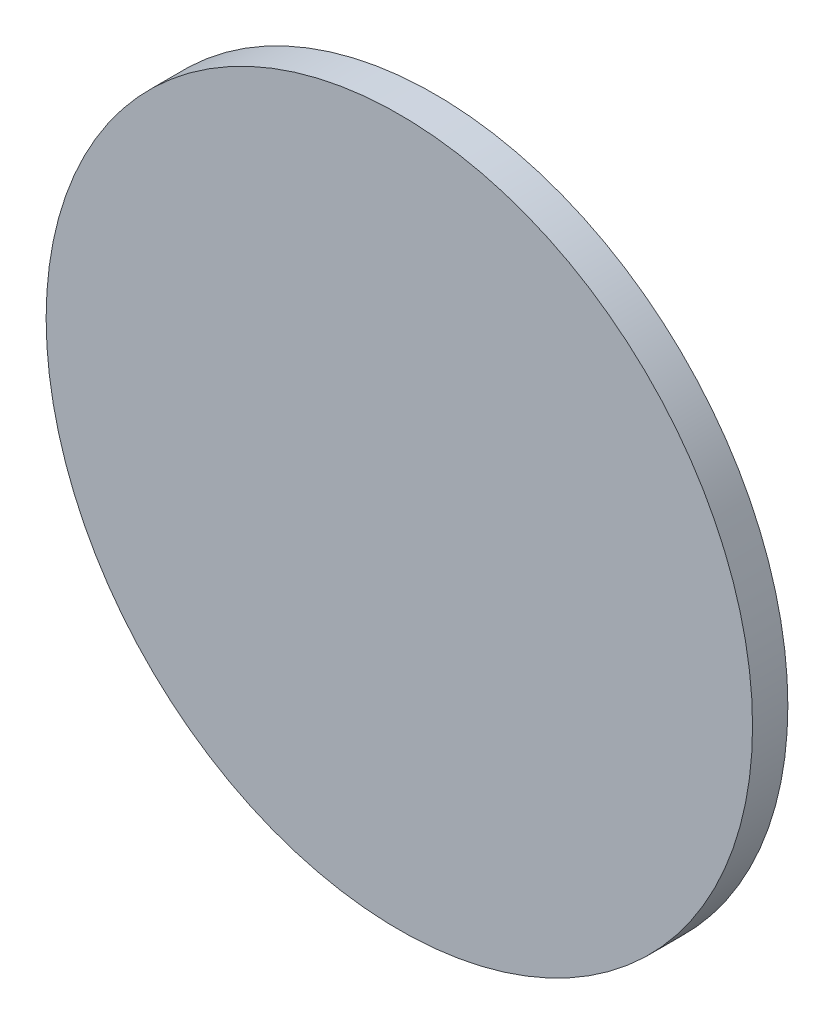
ISO-10303-21;
HEADER;
FILE_DESCRIPTION(('STEP AP214'),'2;1');
FILE_NAME('part.step','',(''),(''),'','','');
FILE_SCHEMA(('AUTOMOTIVE_DESIGN { 1 0 10303 214 1 1 1 1 }'));
ENDSEC;
DATA;
#1=APPLICATION_CONTEXT('core data for automotive mechanical design processes');
#2=APPLICATION_PROTOCOL_DEFINITION('international standard','automotive_design',2000,#1);
#3=PRODUCT_CONTEXT('',#1,'mechanical');
#4=PRODUCT('Part','Part','',(#3));
#5=PRODUCT_RELATED_PRODUCT_CATEGORY('part','',(#4));
#6=PRODUCT_DEFINITION_FORMATION('','',#4);
#7=PRODUCT_DEFINITION_CONTEXT('part definition',#1,'design');
#8=PRODUCT_DEFINITION('design','',#6,#7);
#9=PRODUCT_DEFINITION_SHAPE('','',#8);
#10=(LENGTH_UNIT() NAMED_UNIT(*) SI_UNIT(.MILLI.,.METRE.));
#11=(NAMED_UNIT(*) PLANE_ANGLE_UNIT() SI_UNIT($,.RADIAN.));
#12=(NAMED_UNIT(*) SI_UNIT($,.STERADIAN.) SOLID_ANGLE_UNIT());
#13=UNCERTAINTY_MEASURE_WITH_UNIT(LENGTH_MEASURE(1.E-05),#10,'distance_accuracy_value','');
#14=(GEOMETRIC_REPRESENTATION_CONTEXT(3) GLOBAL_UNCERTAINTY_ASSIGNED_CONTEXT((#13)) GLOBAL_UNIT_ASSIGNED_CONTEXT((#10,
#11,#12)) REPRESENTATION_CONTEXT('',''));
#15=CARTESIAN_POINT('',(0.,0.,0.));
#16=DIRECTION('',(0.,0.,1.));
#17=DIRECTION('',(1.,0.,0.));
#18=AXIS2_PLACEMENT_3D('',#15,#16,#17);
#19=CARTESIAN_POINT('',(0.,0.,3.));
#20=DIRECTION('',(0.,0.,-1.));
#21=DIRECTION('',(-1.,0.,0.));
#22=AXIS2_PLACEMENT_3D('',#19,#20,#21);
#23=CYLINDRICAL_SURFACE('',#22,30.);
#24=CARTESIAN_POINT('',(0.,0.,3.));
#25=DIRECTION('',(0.,0.,1.));
#26=DIRECTION('',(1.,0.,0.));
#27=AXIS2_PLACEMENT_3D('',#24,#25,#26);
#28=CIRCLE('',#27,30.);
#29=CARTESIAN_POINT('',(30.,0.,3.));
#30=VERTEX_POINT('',#29);
#31=EDGE_CURVE('E10',#30,#30,#28,.T.);
#32=ORIENTED_EDGE('',*,*,#31,.F.);
#33=EDGE_LOOP('',(#32));
#34=FACE_BOUND('',#33,.T.);
#35=CARTESIAN_POINT('',(0.,0.,0.));
#36=DIRECTION('',(0.,0.,1.));
#37=DIRECTION('',(1.,0.,0.));
#38=AXIS2_PLACEMENT_3D('',#35,#36,#37);
#39=CIRCLE('',#38,30.);
#40=CARTESIAN_POINT('',(30.,0.,0.));
#41=VERTEX_POINT('',#40);
#42=EDGE_CURVE('E40',#41,#41,#39,.T.);
#43=ORIENTED_EDGE('',*,*,#42,.T.);
#44=EDGE_LOOP('',(#43));
#45=FACE_BOUND('',#44,.T.);
#46=ADVANCED_FACE('F37',(#34,#45),#23,.T.);
#47=CARTESIAN_POINT('',(0.,0.,3.));
#48=DIRECTION('',(0.,0.,1.));
#49=DIRECTION('',(1.,0.,0.));
#50=AXIS2_PLACEMENT_3D('',#47,#48,#49);
#51=PLANE('',#50);
#52=ORIENTED_EDGE('',*,*,#31,.T.);
#53=EDGE_LOOP('',(#52));
#54=FACE_BOUND('',#53,.T.);
#55=ADVANCED_FACE('F54',(#54),#51,.T.);
#56=CARTESIAN_POINT('',(0.,0.,0.));
#57=DIRECTION('',(0.,0.,1.));
#58=DIRECTION('',(1.,0.,0.));
#59=AXIS2_PLACEMENT_3D('',#56,#57,#58);
#60=PLANE('',#59);
#61=ORIENTED_EDGE('',*,*,#42,.F.);
#62=EDGE_LOOP('',(#61));
#63=FACE_BOUND('',#62,.T.);
#64=ADVANCED_FACE('F52',(#63),#60,.F.);
#65=CLOSED_SHELL('',(#46,#55,#64));
#66=MANIFOLD_SOLID_BREP('B2',#65);
#67=ADVANCED_BREP_SHAPE_REPRESENTATION('',(#18,#66),#14);
#68=SHAPE_DEFINITION_REPRESENTATION(#9,#67);
ENDSEC;
END-ISO-10303-21;
